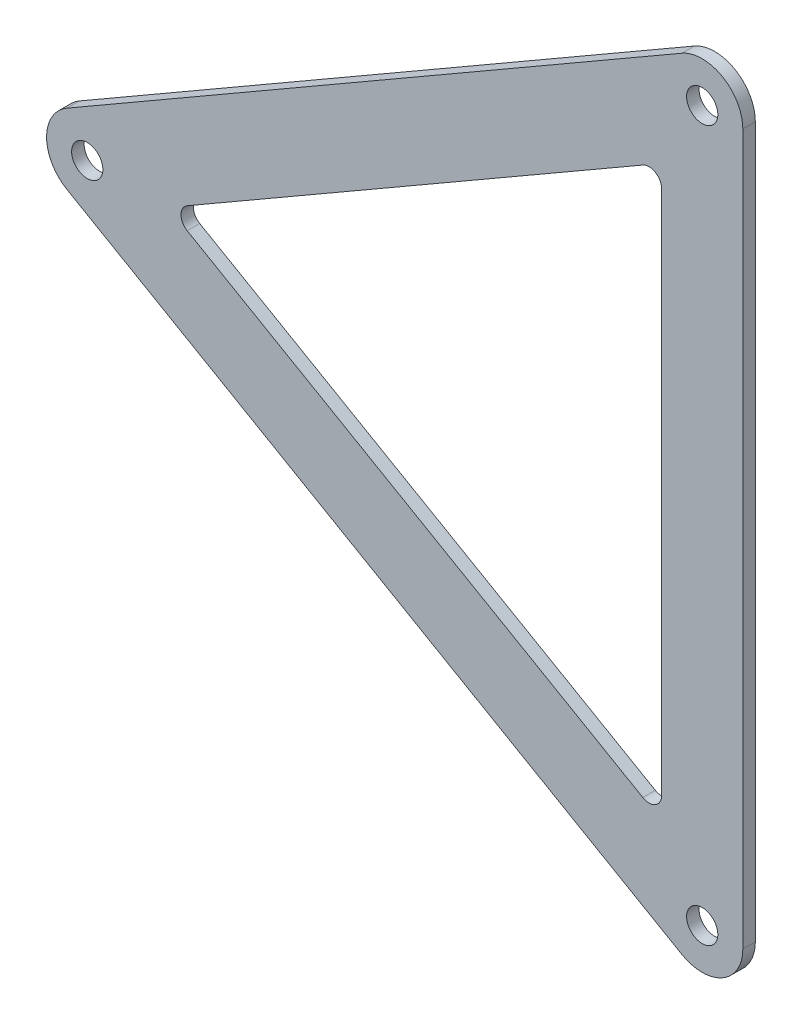
ISO-10303-21;
HEADER;
FILE_DESCRIPTION(('STEP AP214'),'2;1');
FILE_NAME('part.step','',(''),(''),'','','');
FILE_SCHEMA(('AUTOMOTIVE_DESIGN { 1 0 10303 214 1 1 1 1 }'));
ENDSEC;
DATA;
#1=APPLICATION_CONTEXT('core data for automotive mechanical design processes');
#2=APPLICATION_PROTOCOL_DEFINITION('international standard','automotive_design',2000,#1);
#3=PRODUCT_CONTEXT('',#1,'mechanical');
#4=PRODUCT('Part','Part','',(#3));
#5=PRODUCT_RELATED_PRODUCT_CATEGORY('part','',(#4));
#6=PRODUCT_DEFINITION_FORMATION('','',#4);
#7=PRODUCT_DEFINITION_CONTEXT('part definition',#1,'design');
#8=PRODUCT_DEFINITION('design','',#6,#7);
#9=PRODUCT_DEFINITION_SHAPE('','',#8);
#10=(LENGTH_UNIT() NAMED_UNIT(*) SI_UNIT(.MILLI.,.METRE.));
#11=(NAMED_UNIT(*) PLANE_ANGLE_UNIT() SI_UNIT($,.RADIAN.));
#12=(NAMED_UNIT(*) SI_UNIT($,.STERADIAN.) SOLID_ANGLE_UNIT());
#13=UNCERTAINTY_MEASURE_WITH_UNIT(LENGTH_MEASURE(1.E-05),#10,'distance_accuracy_value','');
#14=(GEOMETRIC_REPRESENTATION_CONTEXT(3) GLOBAL_UNCERTAINTY_ASSIGNED_CONTEXT((#13)) GLOBAL_UNIT_ASSIGNED_CONTEXT((#10,
#11,#12)) REPRESENTATION_CONTEXT('',''));
#15=CARTESIAN_POINT('',(0.,0.,0.));
#16=DIRECTION('',(0.,0.,1.));
#17=DIRECTION('',(1.,0.,0.));
#18=AXIS2_PLACEMENT_3D('',#15,#16,#17);
#19=CARTESIAN_POINT('',(65.375,113.232821544815,2.));
#20=DIRECTION('',(0.5,0.866025403784439,0.));
#21=DIRECTION('',(-0.866025403784439,0.5,0.));
#22=AXIS2_PLACEMENT_3D('',#19,#20,#21);
#23=PLANE('',#22);
#24=DIRECTION('',(0.866025403784439,-0.5,0.));
#25=VECTOR('',#24,1.);
#26=CARTESIAN_POINT('',(65.375,113.232821544815,0.));
#27=LINE('',#26,#25);
#28=CARTESIAN_POINT('',(264.5,-1.7320508075689,0.));
#29=VERTEX_POINT('',#28);
#30=CARTESIAN_POINT('',(337.380404909196,-43.8095722005418,0.));
#31=VERTEX_POINT('',#30);
#32=EDGE_CURVE('E182',#29,#31,#27,.T.);
#33=ORIENTED_EDGE('',*,*,#32,.F.);
#34=DIRECTION('',(0.,0.,-1.));
#35=VECTOR('',#34,1.);
#36=CARTESIAN_POINT('',(264.5,-1.7320508075689,2.));
#37=LINE('',#36,#35);
#38=CARTESIAN_POINT('',(264.5,-1.7320508075689,2.));
#39=VERTEX_POINT('',#38);
#40=EDGE_CURVE('E11',#39,#29,#37,.T.);
#41=ORIENTED_EDGE('',*,*,#40,.F.);
#42=DIRECTION('',(0.866025403784439,-0.5,0.));
#43=VECTOR('',#42,1.);
#44=CARTESIAN_POINT('',(65.375,113.232821544815,2.));
#45=LINE('',#44,#43);
#46=CARTESIAN_POINT('',(337.380404909196,-43.8095722005418,2.));
#47=VERTEX_POINT('',#46);
#48=EDGE_CURVE('E255',#39,#47,#45,.T.);
#49=ORIENTED_EDGE('',*,*,#48,.T.);
#50=DIRECTION('',(0.,0.,-1.));
#51=VECTOR('',#50,1.);
#52=CARTESIAN_POINT('',(337.380404909196,-43.8095722005418,2.));
#53=LINE('',#52,#51);
#54=EDGE_CURVE('E99',#47,#31,#53,.T.);
#55=ORIENTED_EDGE('',*,*,#54,.T.);
#56=EDGE_LOOP('',(#33,#41,#49,#55));
#57=FACE_BOUND('',#56,.T.);
#58=ADVANCED_FACE('F34',(#57),#23,.T.);
#59=CARTESIAN_POINT('',(265.5,0.,2.));
#60=DIRECTION('',(0.,0.,-1.));
#61=DIRECTION('',(-1.,0.,0.));
#62=AXIS2_PLACEMENT_3D('',#59,#60,#61);
#63=CYLINDRICAL_SURFACE('',#62,2.00000000000001);
#64=CARTESIAN_POINT('',(265.5,0.,0.));
#65=DIRECTION('',(0.,0.,1.));
#66=DIRECTION('',(1.,0.,0.));
#67=AXIS2_PLACEMENT_3D('',#64,#65,#66);
#68=CIRCLE('',#67,2.00000000000001);
#69=CARTESIAN_POINT('',(264.5,1.7320508075689,0.));
#70=VERTEX_POINT('',#69);
#71=EDGE_CURVE('E185',#29,#70,#68,.F.);
#72=ORIENTED_EDGE('',*,*,#71,.T.);
#73=DIRECTION('',(0.,0.,-1.));
#74=VECTOR('',#73,1.);
#75=CARTESIAN_POINT('',(264.5,1.7320508075689,2.));
#76=LINE('',#75,#74);
#77=CARTESIAN_POINT('',(264.5,1.7320508075689,2.));
#78=VERTEX_POINT('',#77);
#79=EDGE_CURVE('E44',#78,#70,#76,.T.);
#80=ORIENTED_EDGE('',*,*,#79,.F.);
#81=CARTESIAN_POINT('',(265.5,0.,2.));
#82=DIRECTION('',(0.,0.,1.));
#83=DIRECTION('',(1.,0.,0.));
#84=AXIS2_PLACEMENT_3D('',#81,#82,#83);
#85=CIRCLE('',#84,2.00000000000001);
#86=EDGE_CURVE('E257',#39,#78,#85,.F.);
#87=ORIENTED_EDGE('',*,*,#86,.F.);
#88=ORIENTED_EDGE('',*,*,#40,.T.);
#89=EDGE_LOOP('',(#72,#80,#87,#88));
#90=FACE_BOUND('',#89,.T.);
#91=ADVANCED_FACE('F261',(#90),#63,.F.);
#92=CARTESIAN_POINT('',(65.3750000000001,-113.232821544815,2.));
#93=DIRECTION('',(-0.5,0.866025403784438,0.));
#94=DIRECTION('',(-0.866025403784438,-0.5,0.));
#95=AXIS2_PLACEMENT_3D('',#92,#93,#94);
#96=PLANE('',#95);
#97=DIRECTION('',(0.866025403784438,0.5,0.));
#98=VECTOR('',#97,1.);
#99=CARTESIAN_POINT('',(65.3750000000001,-113.232821544815,0.));
#100=LINE('',#99,#98);
#101=CARTESIAN_POINT('',(337.380404909196,43.8095722005418,0.));
#102=VERTEX_POINT('',#101);
#103=EDGE_CURVE('E188',#70,#102,#100,.T.);
#104=ORIENTED_EDGE('',*,*,#103,.T.);
#105=DIRECTION('',(0.,0.,-1.));
#106=VECTOR('',#105,1.);
#107=CARTESIAN_POINT('',(337.380404909196,43.8095722005418,2.));
#108=LINE('',#107,#106);
#109=CARTESIAN_POINT('',(337.380404909196,43.8095722005418,2.));
#110=VERTEX_POINT('',#109);
#111=EDGE_CURVE('E144',#110,#102,#108,.T.);
#112=ORIENTED_EDGE('',*,*,#111,.F.);
#113=DIRECTION('',(0.866025403784438,0.5,0.));
#114=VECTOR('',#113,1.);
#115=CARTESIAN_POINT('',(65.3750000000001,-113.232821544815,2.));
#116=LINE('',#115,#114);
#117=EDGE_CURVE('E149',#78,#110,#116,.T.);
#118=ORIENTED_EDGE('',*,*,#117,.F.);
#119=ORIENTED_EDGE('',*,*,#79,.T.);
#120=EDGE_LOOP('',(#104,#112,#118,#119));
#121=FACE_BOUND('',#120,.T.);
#122=ADVANCED_FACE('F264',(#121),#96,.F.);
#123=CARTESIAN_POINT('',(338.380404909196,42.077521392973,2.));
#124=DIRECTION('',(0.,0.,-1.));
#125=DIRECTION('',(-1.,0.,0.));
#126=AXIS2_PLACEMENT_3D('',#123,#124,#125);
#127=CYLINDRICAL_SURFACE('',#126,2.);
#128=CARTESIAN_POINT('',(338.380404909196,42.077521392973,0.));
#129=DIRECTION('',(0.,0.,1.));
#130=DIRECTION('',(1.,0.,0.));
#131=AXIS2_PLACEMENT_3D('',#128,#129,#130);
#132=CIRCLE('',#131,2.);
#133=CARTESIAN_POINT('',(340.380404909196,42.077521392973,0.));
#134=VERTEX_POINT('',#133);
#135=EDGE_CURVE('E139',#134,#102,#132,.T.);
#136=ORIENTED_EDGE('',*,*,#135,.F.);
#137=DIRECTION('',(0.,0.,-1.));
#138=VECTOR('',#137,1.);
#139=CARTESIAN_POINT('',(340.380404909196,42.077521392973,2.));
#140=LINE('',#139,#138);
#141=CARTESIAN_POINT('',(340.380404909196,42.077521392973,2.));
#142=VERTEX_POINT('',#141);
#143=EDGE_CURVE('E134',#142,#134,#140,.T.);
#144=ORIENTED_EDGE('',*,*,#143,.F.);
#145=CARTESIAN_POINT('',(338.380404909196,42.077521392973,2.));
#146=DIRECTION('',(0.,0.,1.));
#147=DIRECTION('',(1.,0.,0.));
#148=AXIS2_PLACEMENT_3D('',#145,#146,#147);
#149=CIRCLE('',#148,2.);
#150=EDGE_CURVE('E137',#142,#110,#149,.T.);
#151=ORIENTED_EDGE('',*,*,#150,.T.);
#152=ORIENTED_EDGE('',*,*,#111,.T.);
#153=EDGE_LOOP('',(#136,#144,#151,#152));
#154=FACE_BOUND('',#153,.T.);
#155=ADVANCED_FACE('F136',(#154),#127,.F.);
#156=CARTESIAN_POINT('',(340.380404909196,0.,2.));
#157=DIRECTION('',(-1.,0.,0.));
#158=DIRECTION('',(0.,0.,1.));
#159=AXIS2_PLACEMENT_3D('',#156,#157,#158);
#160=PLANE('',#159);
#161=DIRECTION('',(0.,1.,0.));
#162=VECTOR('',#161,1.);
#163=CARTESIAN_POINT('',(340.380404909196,0.,0.));
#164=LINE('',#163,#162);
#165=CARTESIAN_POINT('',(340.380404909196,-42.0775213929729,0.));
#166=VERTEX_POINT('',#165);
#167=EDGE_CURVE('E192',#166,#134,#164,.T.);
#168=ORIENTED_EDGE('',*,*,#167,.F.);
#169=DIRECTION('',(0.,0.,-1.));
#170=VECTOR('',#169,1.);
#171=CARTESIAN_POINT('',(340.380404909196,-42.0775213929729,2.));
#172=LINE('',#171,#170);
#173=CARTESIAN_POINT('',(340.380404909196,-42.0775213929729,2.));
#174=VERTEX_POINT('',#173);
#175=EDGE_CURVE('E92',#174,#166,#172,.T.);
#176=ORIENTED_EDGE('',*,*,#175,.F.);
#177=DIRECTION('',(0.,1.,0.));
#178=VECTOR('',#177,1.);
#179=CARTESIAN_POINT('',(340.380404909196,0.,2.));
#180=LINE('',#179,#178);
#181=EDGE_CURVE('E147',#174,#142,#180,.T.);
#182=ORIENTED_EDGE('',*,*,#181,.T.);
#183=ORIENTED_EDGE('',*,*,#143,.T.);
#184=EDGE_LOOP('',(#168,#176,#182,#183));
#185=FACE_BOUND('',#184,.T.);
#186=ADVANCED_FACE('F152',(#185),#160,.T.);
#187=CARTESIAN_POINT('',(346.880404909196,56.7999532573086,2.));
#188=DIRECTION('',(0.,0.,-1.));
#189=DIRECTION('',(-1.,0.,0.));
#190=AXIS2_PLACEMENT_3D('',#187,#188,#189);
#191=CYLINDRICAL_SURFACE('',#190,6.5);
#192=CARTESIAN_POINT('',(346.880404909196,56.7999532573086,0.));
#193=DIRECTION('',(0.,0.,1.));
#194=DIRECTION('',(1.,0.,0.));
#195=AXIS2_PLACEMENT_3D('',#192,#193,#194);
#196=CIRCLE('',#195,6.5);
#197=CARTESIAN_POINT('',(343.630404909196,62.4291183819074,0.));
#198=VERTEX_POINT('',#197);
#199=CARTESIAN_POINT('',(353.380404909196,56.7999532573086,0.));
#200=VERTEX_POINT('',#199);
#201=EDGE_CURVE('E158',#198,#200,#196,.F.);
#202=ORIENTED_EDGE('',*,*,#201,.F.);
#203=DIRECTION('',(0.,0.,-1.));
#204=VECTOR('',#203,1.);
#205=CARTESIAN_POINT('',(343.630404909196,62.4291183819074,2.));
#206=LINE('',#205,#204);
#207=CARTESIAN_POINT('',(343.630404909196,62.4291183819074,2.));
#208=VERTEX_POINT('',#207);
#209=EDGE_CURVE('E38',#208,#198,#206,.T.);
#210=ORIENTED_EDGE('',*,*,#209,.F.);
#211=CARTESIAN_POINT('',(346.880404909196,56.7999532573086,2.));
#212=DIRECTION('',(0.,0.,1.));
#213=DIRECTION('',(1.,0.,0.));
#214=AXIS2_PLACEMENT_3D('',#211,#212,#213);
#215=CIRCLE('',#214,6.5);
#216=CARTESIAN_POINT('',(353.380404909196,56.7999532573086,2.));
#217=VERTEX_POINT('',#216);
#218=EDGE_CURVE('E196',#208,#217,#215,.F.);
#219=ORIENTED_EDGE('',*,*,#218,.T.);
#220=DIRECTION('',(0.,0.,-1.));
#221=VECTOR('',#220,1.);
#222=CARTESIAN_POINT('',(353.380404909196,56.7999532573086,2.));
#223=LINE('',#222,#221);
#224=EDGE_CURVE('E154',#217,#200,#223,.T.);
#225=ORIENTED_EDGE('',*,*,#224,.T.);
#226=EDGE_LOOP('',(#202,#210,#219,#225));
#227=FACE_BOUND('',#226,.T.);
#228=ADVANCED_FACE('F36',(#227),#191,.T.);
#229=CARTESIAN_POINT('',(58.8750000000003,-101.974491295618,2.));
#230=DIRECTION('',(-0.500000000000001,0.866025403784438,0.));
#231=DIRECTION('',(-0.866025403784438,-0.500000000000001,0.));
#232=AXIS2_PLACEMENT_3D('',#229,#230,#231);
#233=PLANE('',#232);
#234=DIRECTION('',(0.866025403784438,0.500000000000001,0.));
#235=VECTOR('',#234,1.);
#236=CARTESIAN_POINT('',(58.8750000000003,-101.974491295618,0.));
#237=LINE('',#236,#235);
#238=CARTESIAN_POINT('',(245.25,5.62916512459882,0.));
#239=VERTEX_POINT('',#238);
#240=EDGE_CURVE('E161',#239,#198,#237,.T.);
#241=ORIENTED_EDGE('',*,*,#240,.F.);
#242=DIRECTION('',(0.,0.,-1.));
#243=VECTOR('',#242,1.);
#244=CARTESIAN_POINT('',(245.25,5.62916512459882,2.));
#245=LINE('',#244,#243);
#246=CARTESIAN_POINT('',(245.25,5.62916512459882,2.));
#247=VERTEX_POINT('',#246);
#248=EDGE_CURVE('E211',#247,#239,#245,.T.);
#249=ORIENTED_EDGE('',*,*,#248,.F.);
#250=DIRECTION('',(0.866025403784438,0.500000000000001,0.));
#251=VECTOR('',#250,1.);
#252=CARTESIAN_POINT('',(58.8750000000003,-101.974491295618,2.));
#253=LINE('',#252,#251);
#254=EDGE_CURVE('E220',#247,#208,#253,.T.);
#255=ORIENTED_EDGE('',*,*,#254,.T.);
#256=ORIENTED_EDGE('',*,*,#209,.T.);
#257=EDGE_LOOP('',(#241,#249,#255,#256));
#258=FACE_BOUND('',#257,.T.);
#259=ADVANCED_FACE('F218',(#258),#233,.T.);
#260=CARTESIAN_POINT('',(248.5,0.,2.));
#261=DIRECTION('',(0.,0.,-1.));
#262=DIRECTION('',(-1.,0.,0.));
#263=AXIS2_PLACEMENT_3D('',#260,#261,#262);
#264=CYLINDRICAL_SURFACE('',#263,6.49999999999993);
#265=CARTESIAN_POINT('',(248.5,0.,0.));
#266=DIRECTION('',(0.,0.,1.));
#267=DIRECTION('',(1.,0.,0.));
#268=AXIS2_PLACEMENT_3D('',#265,#266,#267);
#269=CIRCLE('',#268,6.49999999999993);
#270=CARTESIAN_POINT('',(245.25,-5.62916512459881,0.));
#271=VERTEX_POINT('',#270);
#272=EDGE_CURVE('E164',#239,#271,#269,.T.);
#273=ORIENTED_EDGE('',*,*,#272,.T.);
#274=DIRECTION('',(0.,0.,-1.));
#275=VECTOR('',#274,1.);
#276=CARTESIAN_POINT('',(245.25,-5.62916512459881,2.));
#277=LINE('',#276,#275);
#278=CARTESIAN_POINT('',(245.25,-5.62916512459881,2.));
#279=VERTEX_POINT('',#278);
#280=EDGE_CURVE('E209',#279,#271,#277,.T.);
#281=ORIENTED_EDGE('',*,*,#280,.F.);
#282=CARTESIAN_POINT('',(248.5,0.,2.));
#283=DIRECTION('',(0.,0.,1.));
#284=DIRECTION('',(1.,0.,0.));
#285=AXIS2_PLACEMENT_3D('',#282,#283,#284);
#286=CIRCLE('',#285,6.49999999999993);
#287=EDGE_CURVE('E238',#247,#279,#286,.T.);
#288=ORIENTED_EDGE('',*,*,#287,.F.);
#289=ORIENTED_EDGE('',*,*,#248,.T.);
#290=EDGE_LOOP('',(#273,#281,#288,#289));
#291=FACE_BOUND('',#290,.T.);
#292=ADVANCED_FACE('F229',(#291),#264,.T.);
#293=CARTESIAN_POINT('',(58.8750000000005,101.974491295618,2.));
#294=DIRECTION('',(0.500000000000002,0.866025403784438,0.));
#295=DIRECTION('',(-0.866025403784438,0.500000000000002,0.));
#296=AXIS2_PLACEMENT_3D('',#293,#294,#295);
#297=PLANE('',#296);
#298=DIRECTION('',(0.866025403784438,-0.500000000000002,0.));
#299=VECTOR('',#298,1.);
#300=CARTESIAN_POINT('',(58.8750000000005,101.974491295618,0.));
#301=LINE('',#300,#299);
#302=CARTESIAN_POINT('',(343.630404909196,-62.4291183819075,0.));
#303=VERTEX_POINT('',#302);
#304=EDGE_CURVE('E166',#271,#303,#301,.T.);
#305=ORIENTED_EDGE('',*,*,#304,.T.);
#306=DIRECTION('',(0.,0.,-1.));
#307=VECTOR('',#306,1.);
#308=CARTESIAN_POINT('',(343.630404909196,-62.4291183819075,2.));
#309=LINE('',#308,#307);
#310=CARTESIAN_POINT('',(343.630404909196,-62.4291183819075,2.));
#311=VERTEX_POINT('',#310);
#312=EDGE_CURVE('E206',#311,#303,#309,.T.);
#313=ORIENTED_EDGE('',*,*,#312,.F.);
#314=DIRECTION('',(0.866025403784438,-0.500000000000002,0.));
#315=VECTOR('',#314,1.);
#316=CARTESIAN_POINT('',(58.8750000000005,101.974491295618,2.));
#317=LINE('',#316,#315);
#318=EDGE_CURVE('E234',#279,#311,#317,.T.);
#319=ORIENTED_EDGE('',*,*,#318,.F.);
#320=ORIENTED_EDGE('',*,*,#280,.T.);
#321=EDGE_LOOP('',(#305,#313,#319,#320));
#322=FACE_BOUND('',#321,.T.);
#323=ADVANCED_FACE('F232',(#322),#297,.F.);
#324=CARTESIAN_POINT('',(346.880404909196,-56.7999532573087,2.));
#325=DIRECTION('',(0.,0.,-1.));
#326=DIRECTION('',(-1.,0.,0.));
#327=AXIS2_PLACEMENT_3D('',#324,#325,#326);
#328=CYLINDRICAL_SURFACE('',#327,6.49999999999997);
#329=CARTESIAN_POINT('',(346.880404909196,-56.7999532573087,0.));
#330=DIRECTION('',(0.,0.,1.));
#331=DIRECTION('',(1.,0.,0.));
#332=AXIS2_PLACEMENT_3D('',#329,#330,#331);
#333=CIRCLE('',#332,6.49999999999997);
#334=CARTESIAN_POINT('',(353.380404909196,-56.7999532573086,0.));
#335=VERTEX_POINT('',#334);
#336=EDGE_CURVE('E168',#303,#335,#333,.T.);
#337=ORIENTED_EDGE('',*,*,#336,.T.);
#338=DIRECTION('',(0.,0.,-1.));
#339=VECTOR('',#338,1.);
#340=CARTESIAN_POINT('',(353.380404909196,-56.7999532573086,2.));
#341=LINE('',#340,#339);
#342=CARTESIAN_POINT('',(353.380404909196,-56.7999532573086,2.));
#343=VERTEX_POINT('',#342);
#344=EDGE_CURVE('E203',#343,#335,#341,.T.);
#345=ORIENTED_EDGE('',*,*,#344,.F.);
#346=CARTESIAN_POINT('',(346.880404909196,-56.7999532573087,2.));
#347=DIRECTION('',(0.,0.,1.));
#348=DIRECTION('',(1.,0.,0.));
#349=AXIS2_PLACEMENT_3D('',#346,#347,#348);
#350=CIRCLE('',#349,6.49999999999997);
#351=EDGE_CURVE('E237',#311,#343,#350,.T.);
#352=ORIENTED_EDGE('',*,*,#351,.F.);
#353=ORIENTED_EDGE('',*,*,#312,.T.);
#354=EDGE_LOOP('',(#337,#345,#352,#353));
#355=FACE_BOUND('',#354,.T.);
#356=ADVANCED_FACE('F279',(#355),#328,.T.);
#357=CARTESIAN_POINT('',(248.5,0.,2.));
#358=DIRECTION('',(0.,0.,-1.));
#359=DIRECTION('',(-1.,0.,0.));
#360=AXIS2_PLACEMENT_3D('',#357,#358,#359);
#361=CYLINDRICAL_SURFACE('',#360,2.50000000000002);
#362=CARTESIAN_POINT('',(248.5,0.,2.));
#363=DIRECTION('',(0.,0.,1.));
#364=DIRECTION('',(1.,0.,0.));
#365=AXIS2_PLACEMENT_3D('',#362,#363,#364);
#366=CIRCLE('',#365,2.50000000000002);
#367=CARTESIAN_POINT('',(251.,0.,2.));
#368=VERTEX_POINT('',#367);
#369=EDGE_CURVE('E252',#368,#368,#366,.T.);
#370=ORIENTED_EDGE('',*,*,#369,.T.);
#371=EDGE_LOOP('',(#370));
#372=FACE_BOUND('',#371,.T.);
#373=CARTESIAN_POINT('',(248.5,0.,0.));
#374=DIRECTION('',(0.,0.,1.));
#375=DIRECTION('',(1.,0.,0.));
#376=AXIS2_PLACEMENT_3D('',#373,#374,#375);
#377=CIRCLE('',#376,2.50000000000002);
#378=CARTESIAN_POINT('',(251.,0.,0.));
#379=VERTEX_POINT('',#378);
#380=EDGE_CURVE('E179',#379,#379,#377,.T.);
#381=ORIENTED_EDGE('',*,*,#380,.F.);
#382=EDGE_LOOP('',(#381));
#383=FACE_BOUND('',#382,.T.);
#384=ADVANCED_FACE('F275',(#372,#383),#361,.F.);
#385=CARTESIAN_POINT('',(346.880404909196,-56.7999532573087,2.));
#386=DIRECTION('',(0.,0.,-1.));
#387=DIRECTION('',(-1.,0.,0.));
#388=AXIS2_PLACEMENT_3D('',#385,#386,#387);
#389=CYLINDRICAL_SURFACE('',#388,2.50000000000003);
#390=CARTESIAN_POINT('',(346.880404909196,-56.7999532573087,2.));
#391=DIRECTION('',(0.,0.,1.));
#392=DIRECTION('',(1.,0.,0.));
#393=AXIS2_PLACEMENT_3D('',#390,#391,#392);
#394=CIRCLE('',#393,2.50000000000003);
#395=CARTESIAN_POINT('',(349.380404909196,-56.7999532573087,2.));
#396=VERTEX_POINT('',#395);
#397=EDGE_CURVE('E249',#396,#396,#394,.T.);
#398=ORIENTED_EDGE('',*,*,#397,.T.);
#399=EDGE_LOOP('',(#398));
#400=FACE_BOUND('',#399,.T.);
#401=CARTESIAN_POINT('',(346.880404909196,-56.7999532573087,0.));
#402=DIRECTION('',(0.,0.,1.));
#403=DIRECTION('',(1.,0.,0.));
#404=AXIS2_PLACEMENT_3D('',#401,#402,#403);
#405=CIRCLE('',#404,2.50000000000003);
#406=CARTESIAN_POINT('',(349.380404909196,-56.7999532573087,0.));
#407=VERTEX_POINT('',#406);
#408=EDGE_CURVE('E176',#407,#407,#405,.T.);
#409=ORIENTED_EDGE('',*,*,#408,.F.);
#410=EDGE_LOOP('',(#409));
#411=FACE_BOUND('',#410,.T.);
#412=ADVANCED_FACE('F278',(#400,#411),#389,.F.);
#413=CARTESIAN_POINT('',(346.880404909196,56.7999532573086,2.));
#414=DIRECTION('',(0.,0.,-1.));
#415=DIRECTION('',(-1.,0.,0.));
#416=AXIS2_PLACEMENT_3D('',#413,#414,#415);
#417=CYLINDRICAL_SURFACE('',#416,2.50000000000002);
#418=CARTESIAN_POINT('',(346.880404909196,56.7999532573086,2.));
#419=DIRECTION('',(0.,0.,1.));
#420=DIRECTION('',(1.,0.,0.));
#421=AXIS2_PLACEMENT_3D('',#418,#419,#420);
#422=CIRCLE('',#421,2.50000000000002);
#423=CARTESIAN_POINT('',(349.380404909196,56.7999532573086,2.));
#424=VERTEX_POINT('',#423);
#425=EDGE_CURVE('E246',#424,#424,#422,.T.);
#426=ORIENTED_EDGE('',*,*,#425,.T.);
#427=EDGE_LOOP('',(#426));
#428=FACE_BOUND('',#427,.T.);
#429=CARTESIAN_POINT('',(346.880404909196,56.7999532573086,0.));
#430=DIRECTION('',(0.,0.,1.));
#431=DIRECTION('',(1.,0.,0.));
#432=AXIS2_PLACEMENT_3D('',#429,#430,#431);
#433=CIRCLE('',#432,2.50000000000002);
#434=CARTESIAN_POINT('',(349.380404909196,56.7999532573086,0.));
#435=VERTEX_POINT('',#434);
#436=EDGE_CURVE('E173',#435,#435,#433,.T.);
#437=ORIENTED_EDGE('',*,*,#436,.F.);
#438=EDGE_LOOP('',(#437));
#439=FACE_BOUND('',#438,.T.);
#440=ADVANCED_FACE('F283',(#428,#439),#417,.F.);
#441=CARTESIAN_POINT('',(353.380404909196,-3.45362134546358E-13,2.));
#442=DIRECTION('',(-1.,0.,0.));
#443=DIRECTION('',(0.,-1.,0.));
#444=AXIS2_PLACEMENT_3D('',#441,#442,#443);
#445=PLANE('',#444);
#446=DIRECTION('',(0.,1.,0.));
#447=VECTOR('',#446,1.);
#448=CARTESIAN_POINT('',(353.380404909196,-3.45362134546358E-13,0.));
#449=LINE('',#448,#447);
#450=EDGE_CURVE('E170',#335,#200,#449,.T.);
#451=ORIENTED_EDGE('',*,*,#450,.T.);
#452=ORIENTED_EDGE('',*,*,#224,.F.);
#453=DIRECTION('',(0.,1.,0.));
#454=VECTOR('',#453,1.);
#455=CARTESIAN_POINT('',(353.380404909196,-3.45362134546358E-13,2.));
#456=LINE('',#455,#454);
#457=EDGE_CURVE('E240',#343,#217,#456,.T.);
#458=ORIENTED_EDGE('',*,*,#457,.F.);
#459=ORIENTED_EDGE('',*,*,#344,.T.);
#460=EDGE_LOOP('',(#451,#452,#458,#459));
#461=FACE_BOUND('',#460,.T.);
#462=ADVANCED_FACE('F287',(#461),#445,.F.);
#463=CARTESIAN_POINT('',(338.380404909196,-42.0775213929729,2.));
#464=DIRECTION('',(0.,0.,-1.));
#465=DIRECTION('',(-1.,0.,0.));
#466=AXIS2_PLACEMENT_3D('',#463,#464,#465);
#467=CYLINDRICAL_SURFACE('',#466,2.);
#468=CARTESIAN_POINT('',(338.380404909196,-42.0775213929729,0.));
#469=DIRECTION('',(0.,0.,1.));
#470=DIRECTION('',(1.,0.,0.));
#471=AXIS2_PLACEMENT_3D('',#468,#469,#470);
#472=CIRCLE('',#471,2.);
#473=EDGE_CURVE('E194',#166,#31,#472,.F.);
#474=ORIENTED_EDGE('',*,*,#473,.T.);
#475=ORIENTED_EDGE('',*,*,#54,.F.);
#476=CARTESIAN_POINT('',(338.380404909196,-42.0775213929729,2.));
#477=DIRECTION('',(0.,0.,1.));
#478=DIRECTION('',(1.,0.,0.));
#479=AXIS2_PLACEMENT_3D('',#476,#477,#478);
#480=CIRCLE('',#479,2.);
#481=EDGE_CURVE('E53',#174,#47,#480,.F.);
#482=ORIENTED_EDGE('',*,*,#481,.F.);
#483=ORIENTED_EDGE('',*,*,#175,.T.);
#484=EDGE_LOOP('',(#474,#475,#482,#483));
#485=FACE_BOUND('',#484,.T.);
#486=ADVANCED_FACE('F266',(#485),#467,.F.);
#487=CARTESIAN_POINT('',(0.,0.,2.));
#488=DIRECTION('',(0.,0.,1.));
#489=DIRECTION('',(1.,0.,0.));
#490=AXIS2_PLACEMENT_3D('',#487,#488,#489);
#491=PLANE('',#490);
#492=ORIENTED_EDGE('',*,*,#218,.F.);
#493=ORIENTED_EDGE('',*,*,#254,.F.);
#494=ORIENTED_EDGE('',*,*,#287,.T.);
#495=ORIENTED_EDGE('',*,*,#318,.T.);
#496=ORIENTED_EDGE('',*,*,#351,.T.);
#497=ORIENTED_EDGE('',*,*,#457,.T.);
#498=EDGE_LOOP('',(#492,#493,#494,#495,#496,#497));
#499=FACE_BOUND('',#498,.T.);
#500=ORIENTED_EDGE('',*,*,#425,.F.);
#501=EDGE_LOOP('',(#500));
#502=FACE_BOUND('',#501,.T.);
#503=ORIENTED_EDGE('',*,*,#397,.F.);
#504=EDGE_LOOP('',(#503));
#505=FACE_BOUND('',#504,.T.);
#506=ORIENTED_EDGE('',*,*,#369,.F.);
#507=EDGE_LOOP('',(#506));
#508=FACE_BOUND('',#507,.T.);
#509=ORIENTED_EDGE('',*,*,#48,.F.);
#510=ORIENTED_EDGE('',*,*,#86,.T.);
#511=ORIENTED_EDGE('',*,*,#117,.T.);
#512=ORIENTED_EDGE('',*,*,#150,.F.);
#513=ORIENTED_EDGE('',*,*,#181,.F.);
#514=ORIENTED_EDGE('',*,*,#481,.T.);
#515=EDGE_LOOP('',(#509,#510,#511,#512,#513,#514));
#516=FACE_BOUND('',#515,.T.);
#517=ADVANCED_FACE('F146',(#499,#502,#505,#508,#516),#491,.T.);
#518=CARTESIAN_POINT('',(0.,0.,0.));
#519=DIRECTION('',(0.,0.,1.));
#520=DIRECTION('',(1.,0.,0.));
#521=AXIS2_PLACEMENT_3D('',#518,#519,#520);
#522=PLANE('',#521);
#523=ORIENTED_EDGE('',*,*,#201,.T.);
#524=ORIENTED_EDGE('',*,*,#450,.F.);
#525=ORIENTED_EDGE('',*,*,#336,.F.);
#526=ORIENTED_EDGE('',*,*,#304,.F.);
#527=ORIENTED_EDGE('',*,*,#272,.F.);
#528=ORIENTED_EDGE('',*,*,#240,.T.);
#529=EDGE_LOOP('',(#523,#524,#525,#526,#527,#528));
#530=FACE_BOUND('',#529,.T.);
#531=ORIENTED_EDGE('',*,*,#436,.T.);
#532=EDGE_LOOP('',(#531));
#533=FACE_BOUND('',#532,.T.);
#534=ORIENTED_EDGE('',*,*,#408,.T.);
#535=EDGE_LOOP('',(#534));
#536=FACE_BOUND('',#535,.T.);
#537=ORIENTED_EDGE('',*,*,#380,.T.);
#538=EDGE_LOOP('',(#537));
#539=FACE_BOUND('',#538,.T.);
#540=ORIENTED_EDGE('',*,*,#32,.T.);
#541=ORIENTED_EDGE('',*,*,#473,.F.);
#542=ORIENTED_EDGE('',*,*,#167,.T.);
#543=ORIENTED_EDGE('',*,*,#135,.T.);
#544=ORIENTED_EDGE('',*,*,#103,.F.);
#545=ORIENTED_EDGE('',*,*,#71,.F.);
#546=EDGE_LOOP('',(#540,#541,#542,#543,#544,#545));
#547=FACE_BOUND('',#546,.T.);
#548=ADVANCED_FACE('F224',(#530,#533,#536,#539,#547),#522,.F.);
#549=CLOSED_SHELL('',(#58,#91,#122,#155,#186,#228,#259,#292,#323,#356,#384,#412,#440,#462,#486,
#517,#548));
#550=MANIFOLD_SOLID_BREP('B2',#549);
#551=ADVANCED_BREP_SHAPE_REPRESENTATION('',(#18,#550),#14);
#552=SHAPE_DEFINITION_REPRESENTATION(#9,#551);
ENDSEC;
END-ISO-10303-21;
